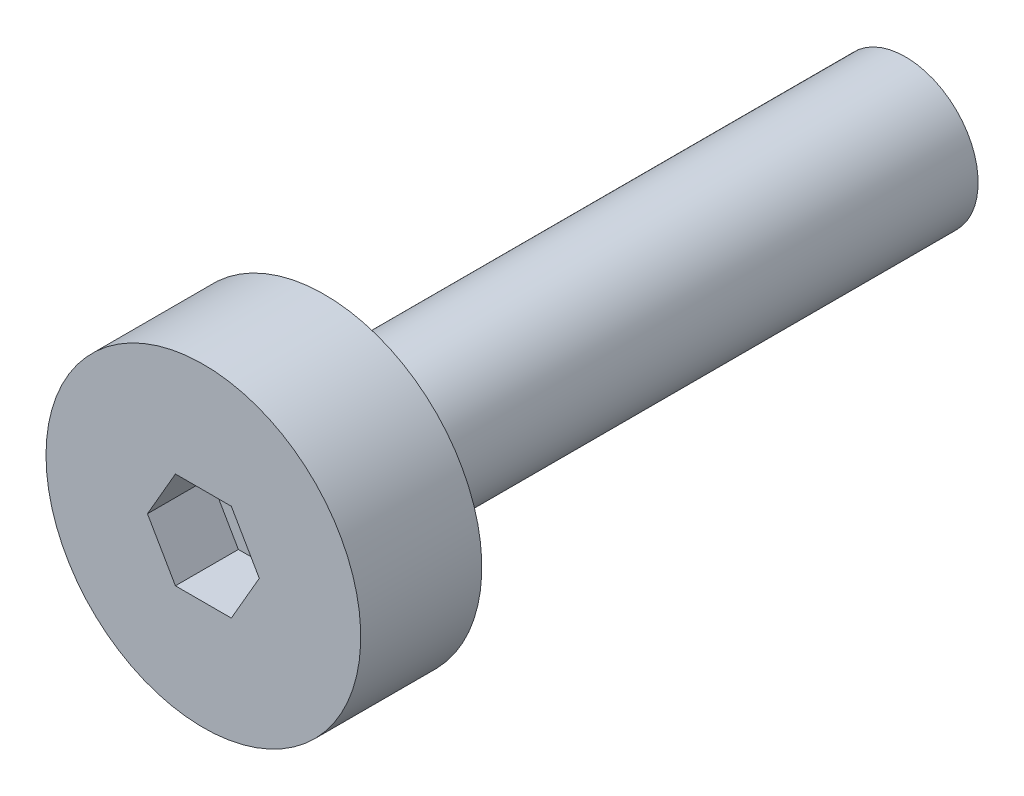
ISO-10303-21;
HEADER;
FILE_DESCRIPTION(('STEP AP214'),'2;1');
FILE_NAME('part.step','',(''),(''),'','','');
FILE_SCHEMA(('AUTOMOTIVE_DESIGN { 1 0 10303 214 1 1 1 1 }'));
ENDSEC;
DATA;
#1=APPLICATION_CONTEXT('core data for automotive mechanical design processes');
#2=APPLICATION_PROTOCOL_DEFINITION('international standard','automotive_design',2000,#1);
#3=PRODUCT_CONTEXT('',#1,'mechanical');
#4=PRODUCT('Part','Part','',(#3));
#5=PRODUCT_RELATED_PRODUCT_CATEGORY('part','',(#4));
#6=PRODUCT_DEFINITION_FORMATION('','',#4);
#7=PRODUCT_DEFINITION_CONTEXT('part definition',#1,'design');
#8=PRODUCT_DEFINITION('design','',#6,#7);
#9=PRODUCT_DEFINITION_SHAPE('','',#8);
#10=(LENGTH_UNIT() NAMED_UNIT(*) SI_UNIT(.MILLI.,.METRE.));
#11=(NAMED_UNIT(*) PLANE_ANGLE_UNIT() SI_UNIT($,.RADIAN.));
#12=(NAMED_UNIT(*) SI_UNIT($,.STERADIAN.) SOLID_ANGLE_UNIT());
#13=UNCERTAINTY_MEASURE_WITH_UNIT(LENGTH_MEASURE(1.E-05),#10,'distance_accuracy_value','');
#14=(GEOMETRIC_REPRESENTATION_CONTEXT(3) GLOBAL_UNCERTAINTY_ASSIGNED_CONTEXT((#13)) GLOBAL_UNIT_ASSIGNED_CONTEXT((#10,
#11,#12)) REPRESENTATION_CONTEXT('',''));
#15=CARTESIAN_POINT('',(0.,0.,0.));
#16=DIRECTION('',(0.,0.,1.));
#17=DIRECTION('',(1.,0.,0.));
#18=AXIS2_PLACEMENT_3D('',#15,#16,#17);
#19=CARTESIAN_POINT('',(0.,0.,1.2));
#20=DIRECTION('',(0.,0.,1.));
#21=DIRECTION('',(1.,0.,0.));
#22=AXIS2_PLACEMENT_3D('',#19,#20,#21);
#23=PLANE('',#22);
#24=DIRECTION('',(-0.50000000000019,0.866025403784329,0.));
#25=VECTOR('',#24,1.);
#26=CARTESIAN_POINT('',(1.154700538379,0.,1.2));
#27=LINE('',#26,#25);
#28=CARTESIAN_POINT('',(1.154700538379,0.,1.2));
#29=VERTEX_POINT('',#28);
#30=CARTESIAN_POINT('',(0.57735026919,1.,1.2));
#31=VERTEX_POINT('',#30);
#32=EDGE_CURVE('E9',#29,#31,#27,.T.);
#33=ORIENTED_EDGE('',*,*,#32,.T.);
#34=DIRECTION('',(-1.,0.,0.));
#35=VECTOR('',#34,1.);
#36=CARTESIAN_POINT('',(0.57735026919,1.,1.2));
#37=LINE('',#36,#35);
#38=CARTESIAN_POINT('',(-0.57735026919,1.,1.2));
#39=VERTEX_POINT('',#38);
#40=EDGE_CURVE('E146',#31,#39,#37,.T.);
#41=ORIENTED_EDGE('',*,*,#40,.T.);
#42=DIRECTION('',(-0.50000000000019,-0.866025403784329,0.));
#43=VECTOR('',#42,1.);
#44=CARTESIAN_POINT('',(-0.57735026919,1.,1.2));
#45=LINE('',#44,#43);
#46=CARTESIAN_POINT('',(-1.154700538379,0.,1.2));
#47=VERTEX_POINT('',#46);
#48=EDGE_CURVE('E18',#39,#47,#45,.T.);
#49=ORIENTED_EDGE('',*,*,#48,.T.);
#50=DIRECTION('',(0.50000000000019,-0.866025403784329,0.));
#51=VECTOR('',#50,1.);
#52=CARTESIAN_POINT('',(-1.154700538379,0.,1.2));
#53=LINE('',#52,#51);
#54=CARTESIAN_POINT('',(-0.57735026919,-1.,1.2));
#55=VERTEX_POINT('',#54);
#56=EDGE_CURVE('E91',#47,#55,#53,.T.);
#57=ORIENTED_EDGE('',*,*,#56,.T.);
#58=DIRECTION('',(1.,0.,0.));
#59=VECTOR('',#58,1.);
#60=CARTESIAN_POINT('',(-0.57735026919,-1.,1.2));
#61=LINE('',#60,#59);
#62=CARTESIAN_POINT('',(0.57735026919,-1.,1.2));
#63=VERTEX_POINT('',#62);
#64=EDGE_CURVE('E79',#55,#63,#61,.T.);
#65=ORIENTED_EDGE('',*,*,#64,.T.);
#66=DIRECTION('',(0.50000000000019,0.866025403784329,0.));
#67=VECTOR('',#66,1.);
#68=CARTESIAN_POINT('',(0.57735026919,-1.,1.2));
#69=LINE('',#68,#67);
#70=EDGE_CURVE('E113',#63,#29,#69,.T.);
#71=ORIENTED_EDGE('',*,*,#70,.T.);
#72=EDGE_LOOP('',(#33,#41,#49,#57,#65,#71));
#73=FACE_BOUND('',#72,.T.);
#74=ADVANCED_FACE('F14',(#73),#23,.T.);
#75=CARTESIAN_POINT('',(0.,0.,-12.));
#76=DIRECTION('',(0.,0.,-1.));
#77=DIRECTION('',(0.,-1.,0.));
#78=AXIS2_PLACEMENT_3D('',#75,#76,#77);
#79=PLANE('',#78);
#80=CARTESIAN_POINT('',(0.,0.,-12.));
#81=DIRECTION('',(0.,0.,-1.));
#82=DIRECTION('',(-1.,0.,0.));
#83=AXIS2_PLACEMENT_3D('',#80,#81,#82);
#84=CIRCLE('',#83,1.5);
#85=CARTESIAN_POINT('',(-1.5,0.,-12.));
#86=VERTEX_POINT('',#85);
#87=EDGE_CURVE('E111',#86,#86,#84,.T.);
#88=ORIENTED_EDGE('',*,*,#87,.T.);
#89=EDGE_LOOP('',(#88));
#90=FACE_BOUND('',#89,.T.);
#91=ADVANCED_FACE('F254',(#90),#79,.T.);
#92=CARTESIAN_POINT('',(1.154700538379,0.,1.2));
#93=DIRECTION('',(-0.866025403784329,-0.50000000000019,0.));
#94=DIRECTION('',(-0.50000000000019,0.866025403784329,0.));
#95=AXIS2_PLACEMENT_3D('',#92,#93,#94);
#96=PLANE('',#95);
#97=ORIENTED_EDGE('',*,*,#32,.F.);
#98=DIRECTION('',(0.,0.,1.));
#99=VECTOR('',#98,1.);
#100=CARTESIAN_POINT('',(1.154700538379,0.,1.2));
#101=LINE('',#100,#99);
#102=CARTESIAN_POINT('',(1.154700538379,0.,2.5));
#103=VERTEX_POINT('',#102);
#104=EDGE_CURVE('E151',#29,#103,#101,.T.);
#105=ORIENTED_EDGE('',*,*,#104,.T.);
#106=DIRECTION('',(-0.50000000000019,0.866025403784329,0.));
#107=VECTOR('',#106,1.);
#108=CARTESIAN_POINT('',(1.010362971082,0.25,2.5));
#109=LINE('',#108,#107);
#110=CARTESIAN_POINT('',(0.57735026919,1.,2.5));
#111=VERTEX_POINT('',#110);
#112=EDGE_CURVE('E135',#103,#111,#109,.T.);
#113=ORIENTED_EDGE('',*,*,#112,.T.);
#114=DIRECTION('',(0.,0.,1.));
#115=VECTOR('',#114,1.);
#116=CARTESIAN_POINT('',(0.57735026919,1.,1.2));
#117=LINE('',#116,#115);
#118=EDGE_CURVE('E25',#31,#111,#117,.T.);
#119=ORIENTED_EDGE('',*,*,#118,.F.);
#120=EDGE_LOOP('',(#97,#105,#113,#119));
#121=FACE_BOUND('',#120,.T.);
#122=ADVANCED_FACE('F16',(#121),#96,.T.);
#123=CARTESIAN_POINT('',(0.57735026919,1.,1.2));
#124=DIRECTION('',(0.,-1.,0.));
#125=DIRECTION('',(-1.,0.,0.));
#126=AXIS2_PLACEMENT_3D('',#123,#124,#125);
#127=PLANE('',#126);
#128=ORIENTED_EDGE('',*,*,#40,.F.);
#129=ORIENTED_EDGE('',*,*,#118,.T.);
#130=DIRECTION('',(-1.,0.,0.));
#131=VECTOR('',#130,1.);
#132=CARTESIAN_POINT('',(0.288675134595,1.,2.5));
#133=LINE('',#132,#131);
#134=CARTESIAN_POINT('',(-0.57735026919,1.,2.5));
#135=VERTEX_POINT('',#134);
#136=EDGE_CURVE('E139',#111,#135,#133,.T.);
#137=ORIENTED_EDGE('',*,*,#136,.T.);
#138=DIRECTION('',(0.,0.,1.));
#139=VECTOR('',#138,1.);
#140=CARTESIAN_POINT('',(-0.57735026919,1.,1.2));
#141=LINE('',#140,#139);
#142=EDGE_CURVE('E143',#39,#135,#141,.T.);
#143=ORIENTED_EDGE('',*,*,#142,.F.);
#144=EDGE_LOOP('',(#128,#129,#137,#143));
#145=FACE_BOUND('',#144,.T.);
#146=ADVANCED_FACE('F196',(#145),#127,.T.);
#147=CARTESIAN_POINT('',(-0.57735026919,1.,1.2));
#148=DIRECTION('',(0.866025403784329,-0.50000000000019,0.));
#149=DIRECTION('',(0.,0.,-1.));
#150=AXIS2_PLACEMENT_3D('',#147,#148,#149);
#151=PLANE('',#150);
#152=ORIENTED_EDGE('',*,*,#48,.F.);
#153=ORIENTED_EDGE('',*,*,#142,.T.);
#154=DIRECTION('',(-0.50000000000019,-0.866025403784329,0.));
#155=VECTOR('',#154,1.);
#156=CARTESIAN_POINT('',(-0.721687836487,0.75,2.5));
#157=LINE('',#156,#155);
#158=CARTESIAN_POINT('',(-1.154700538379,0.,2.5));
#159=VERTEX_POINT('',#158);
#160=EDGE_CURVE('E160',#135,#159,#157,.T.);
#161=ORIENTED_EDGE('',*,*,#160,.T.);
#162=DIRECTION('',(0.,0.,1.));
#163=VECTOR('',#162,1.);
#164=CARTESIAN_POINT('',(-1.154700538379,0.,1.2));
#165=LINE('',#164,#163);
#166=EDGE_CURVE('E142',#47,#159,#165,.T.);
#167=ORIENTED_EDGE('',*,*,#166,.F.);
#168=EDGE_LOOP('',(#152,#153,#161,#167));
#169=FACE_BOUND('',#168,.T.);
#170=ADVANCED_FACE('F200',(#169),#151,.T.);
#171=CARTESIAN_POINT('',(-1.154700538379,0.,1.2));
#172=DIRECTION('',(0.866025403784329,0.50000000000019,0.));
#173=DIRECTION('',(0.,0.,-1.));
#174=AXIS2_PLACEMENT_3D('',#171,#172,#173);
#175=PLANE('',#174);
#176=ORIENTED_EDGE('',*,*,#56,.F.);
#177=ORIENTED_EDGE('',*,*,#166,.T.);
#178=DIRECTION('',(0.50000000000019,-0.866025403784329,0.));
#179=VECTOR('',#178,1.);
#180=CARTESIAN_POINT('',(-1.010362971082,-0.25,2.5));
#181=LINE('',#180,#179);
#182=CARTESIAN_POINT('',(-0.57735026919,-1.,2.5));
#183=VERTEX_POINT('',#182);
#184=EDGE_CURVE('E130',#159,#183,#181,.T.);
#185=ORIENTED_EDGE('',*,*,#184,.T.);
#186=DIRECTION('',(0.,0.,1.));
#187=VECTOR('',#186,1.);
#188=CARTESIAN_POINT('',(-0.57735026919,-1.,1.2));
#189=LINE('',#188,#187);
#190=EDGE_CURVE('E124',#55,#183,#189,.T.);
#191=ORIENTED_EDGE('',*,*,#190,.F.);
#192=EDGE_LOOP('',(#176,#177,#185,#191));
#193=FACE_BOUND('',#192,.T.);
#194=ADVANCED_FACE('F203',(#193),#175,.T.);
#195=CARTESIAN_POINT('',(-0.57735026919,-1.,1.2));
#196=DIRECTION('',(0.,1.,0.));
#197=DIRECTION('',(1.,0.,0.));
#198=AXIS2_PLACEMENT_3D('',#195,#196,#197);
#199=PLANE('',#198);
#200=ORIENTED_EDGE('',*,*,#64,.F.);
#201=ORIENTED_EDGE('',*,*,#190,.T.);
#202=DIRECTION('',(1.,0.,0.));
#203=VECTOR('',#202,1.);
#204=CARTESIAN_POINT('',(-0.288675134595,-1.,2.5));
#205=LINE('',#204,#203);
#206=CARTESIAN_POINT('',(0.57735026919,-1.,2.5));
#207=VERTEX_POINT('',#206);
#208=EDGE_CURVE('E126',#183,#207,#205,.T.);
#209=ORIENTED_EDGE('',*,*,#208,.T.);
#210=DIRECTION('',(0.,0.,1.));
#211=VECTOR('',#210,1.);
#212=CARTESIAN_POINT('',(0.57735026919,-1.,1.2));
#213=LINE('',#212,#211);
#214=EDGE_CURVE('E118',#63,#207,#213,.T.);
#215=ORIENTED_EDGE('',*,*,#214,.F.);
#216=EDGE_LOOP('',(#200,#201,#209,#215));
#217=FACE_BOUND('',#216,.T.);
#218=ADVANCED_FACE('F205',(#217),#199,.T.);
#219=CARTESIAN_POINT('',(0.57735026919,-1.,1.2));
#220=DIRECTION('',(-0.866025403784329,0.50000000000019,0.));
#221=DIRECTION('',(0.,0.,1.));
#222=AXIS2_PLACEMENT_3D('',#219,#220,#221);
#223=PLANE('',#222);
#224=ORIENTED_EDGE('',*,*,#70,.F.);
#225=ORIENTED_EDGE('',*,*,#214,.T.);
#226=DIRECTION('',(0.50000000000019,0.866025403784329,0.));
#227=VECTOR('',#226,1.);
#228=CARTESIAN_POINT('',(0.721687836487,-0.75,2.5));
#229=LINE('',#228,#227);
#230=EDGE_CURVE('E121',#207,#103,#229,.T.);
#231=ORIENTED_EDGE('',*,*,#230,.T.);
#232=ORIENTED_EDGE('',*,*,#104,.F.);
#233=EDGE_LOOP('',(#224,#225,#231,#232));
#234=FACE_BOUND('',#233,.T.);
#235=ADVANCED_FACE('F186',(#234),#223,.T.);
#236=CARTESIAN_POINT('',(0.,0.,0.));
#237=DIRECTION('',(0.,0.,-1.));
#238=DIRECTION('',(-1.,0.,0.));
#239=AXIS2_PLACEMENT_3D('',#236,#237,#238);
#240=CYLINDRICAL_SURFACE('',#239,1.5);
#241=ORIENTED_EDGE('',*,*,#87,.F.);
#242=DIRECTION('',(0.,0.,-1.));
#243=VECTOR('',#242,1.);
#244=CARTESIAN_POINT('',(-1.5,0.,0.));
#245=LINE('',#244,#243);
#246=CARTESIAN_POINT('',(-1.5,0.,0.));
#247=VERTEX_POINT('',#246);
#248=EDGE_CURVE('E106',#247,#86,#245,.T.);
#249=ORIENTED_EDGE('',*,*,#248,.F.);
#250=CARTESIAN_POINT('',(0.,0.,0.));
#251=DIRECTION('',(0.,0.,-1.));
#252=DIRECTION('',(-1.,0.,0.));
#253=AXIS2_PLACEMENT_3D('',#250,#251,#252);
#254=CIRCLE('',#253,1.5);
#255=EDGE_CURVE('E109',#247,#247,#254,.T.);
#256=ORIENTED_EDGE('',*,*,#255,.T.);
#257=ORIENTED_EDGE('',*,*,#248,.T.);
#258=EDGE_LOOP('',(#241,#249,#256,#257));
#259=FACE_BOUND('',#258,.T.);
#260=ADVANCED_FACE('F107',(#259),#240,.T.);
#261=CARTESIAN_POINT('',(0.,0.,2.5));
#262=DIRECTION('',(0.,0.,-1.));
#263=DIRECTION('',(0.,-1.,0.));
#264=AXIS2_PLACEMENT_3D('',#261,#262,#263);
#265=PLANE('',#264);
#266=ORIENTED_EDGE('',*,*,#208,.F.);
#267=ORIENTED_EDGE('',*,*,#184,.F.);
#268=ORIENTED_EDGE('',*,*,#160,.F.);
#269=ORIENTED_EDGE('',*,*,#136,.F.);
#270=ORIENTED_EDGE('',*,*,#112,.F.);
#271=ORIENTED_EDGE('',*,*,#230,.F.);
#272=EDGE_LOOP('',(#266,#267,#268,#269,#270,#271));
#273=FACE_BOUND('',#272,.T.);
#274=CARTESIAN_POINT('',(0.,0.,2.5));
#275=DIRECTION('',(0.,0.,-1.));
#276=DIRECTION('',(-1.,0.,0.));
#277=AXIS2_PLACEMENT_3D('',#274,#275,#276);
#278=CIRCLE('',#277,3.25);
#279=CARTESIAN_POINT('',(-3.25,0.,2.5));
#280=VERTEX_POINT('',#279);
#281=EDGE_CURVE('E131',#280,#280,#278,.T.);
#282=ORIENTED_EDGE('',*,*,#281,.F.);
#283=EDGE_LOOP('',(#282));
#284=FACE_BOUND('',#283,.T.);
#285=ADVANCED_FACE('F190',(#273,#284),#265,.F.);
#286=CARTESIAN_POINT('',(0.,0.,0.));
#287=DIRECTION('',(0.,0.,-1.));
#288=DIRECTION('',(0.,-1.,0.));
#289=AXIS2_PLACEMENT_3D('',#286,#287,#288);
#290=PLANE('',#289);
#291=ORIENTED_EDGE('',*,*,#255,.F.);
#292=EDGE_LOOP('',(#291));
#293=FACE_BOUND('',#292,.T.);
#294=CARTESIAN_POINT('',(0.,0.,0.));
#295=DIRECTION('',(0.,0.,-1.));
#296=DIRECTION('',(-1.,0.,0.));
#297=AXIS2_PLACEMENT_3D('',#294,#295,#296);
#298=CIRCLE('',#297,3.25);
#299=CARTESIAN_POINT('',(-3.25,0.,0.));
#300=VERTEX_POINT('',#299);
#301=EDGE_CURVE('E152',#300,#300,#298,.T.);
#302=ORIENTED_EDGE('',*,*,#301,.T.);
#303=EDGE_LOOP('',(#302));
#304=FACE_BOUND('',#303,.T.);
#305=ADVANCED_FACE('F271',(#293,#304),#290,.T.);
#306=CARTESIAN_POINT('',(0.,0.,2.5));
#307=DIRECTION('',(0.,0.,-1.));
#308=DIRECTION('',(-1.,0.,0.));
#309=AXIS2_PLACEMENT_3D('',#306,#307,#308);
#310=CYLINDRICAL_SURFACE('',#309,3.25);
#311=ORIENTED_EDGE('',*,*,#301,.F.);
#312=DIRECTION('',(0.,0.,-1.));
#313=VECTOR('',#312,1.);
#314=CARTESIAN_POINT('',(-3.25,0.,2.5));
#315=LINE('',#314,#313);
#316=EDGE_CURVE('E134',#280,#300,#315,.T.);
#317=ORIENTED_EDGE('',*,*,#316,.F.);
#318=ORIENTED_EDGE('',*,*,#281,.T.);
#319=ORIENTED_EDGE('',*,*,#316,.T.);
#320=EDGE_LOOP('',(#311,#317,#318,#319));
#321=FACE_BOUND('',#320,.T.);
#322=ADVANCED_FACE('F274',(#321),#310,.T.);
#323=CLOSED_SHELL('',(#74,#91,#122,#146,#170,#194,#218,#235,#260,#285,#305,#322));
#324=MANIFOLD_SOLID_BREP('B1',#323);
#325=ADVANCED_BREP_SHAPE_REPRESENTATION('',(#18,#324),#14);
#326=SHAPE_DEFINITION_REPRESENTATION(#9,#325);
ENDSEC;
END-ISO-10303-21;
